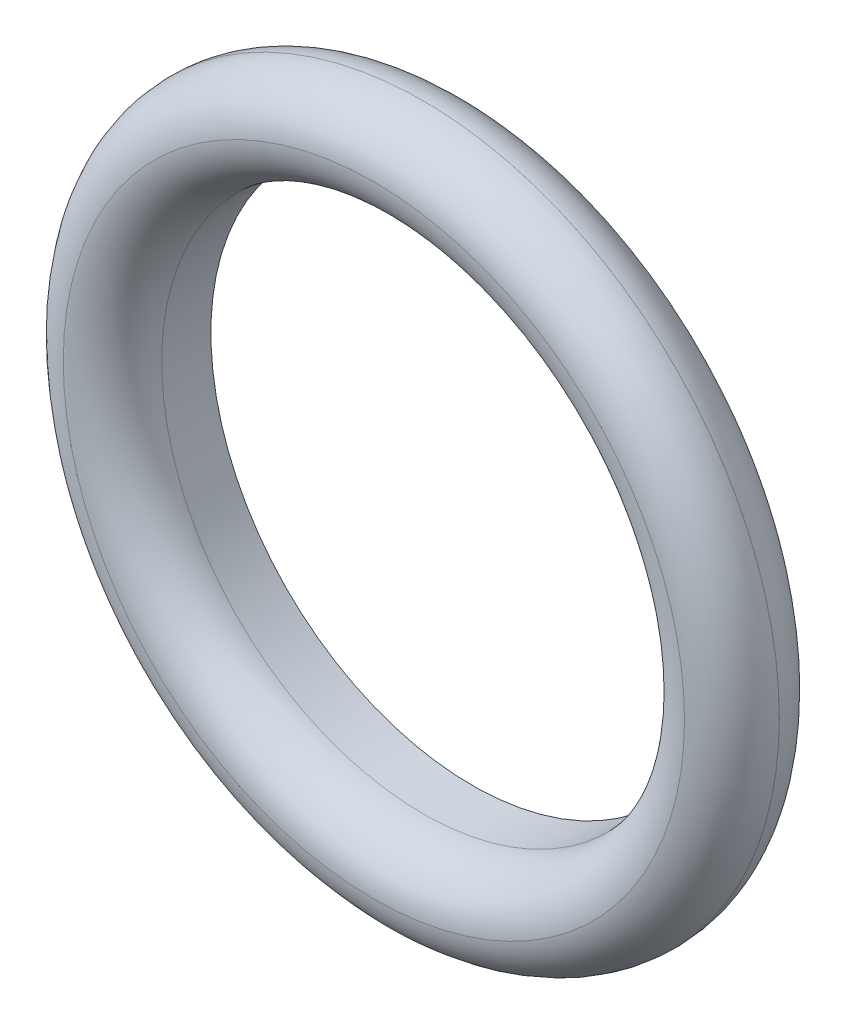
ISO-10303-21;
HEADER;
FILE_DESCRIPTION(('STEP AP214'),'2;1');
FILE_NAME('part.step','',(''),(''),'','','');
FILE_SCHEMA(('AUTOMOTIVE_DESIGN { 1 0 10303 214 1 1 1 1 }'));
ENDSEC;
DATA;
#1=APPLICATION_CONTEXT('core data for automotive mechanical design processes');
#2=APPLICATION_PROTOCOL_DEFINITION('international standard','automotive_design',2000,#1);
#3=PRODUCT_CONTEXT('',#1,'mechanical');
#4=PRODUCT('Part','Part','',(#3));
#5=PRODUCT_RELATED_PRODUCT_CATEGORY('part','',(#4));
#6=PRODUCT_DEFINITION_FORMATION('','',#4);
#7=PRODUCT_DEFINITION_CONTEXT('part definition',#1,'design');
#8=PRODUCT_DEFINITION('design','',#6,#7);
#9=PRODUCT_DEFINITION_SHAPE('','',#8);
#10=(LENGTH_UNIT() NAMED_UNIT(*) SI_UNIT(.MILLI.,.METRE.));
#11=(NAMED_UNIT(*) PLANE_ANGLE_UNIT() SI_UNIT($,.RADIAN.));
#12=(NAMED_UNIT(*) SI_UNIT($,.STERADIAN.) SOLID_ANGLE_UNIT());
#13=UNCERTAINTY_MEASURE_WITH_UNIT(LENGTH_MEASURE(1.E-05),#10,'distance_accuracy_value','');
#14=(GEOMETRIC_REPRESENTATION_CONTEXT(3) GLOBAL_UNCERTAINTY_ASSIGNED_CONTEXT((#13)) GLOBAL_UNIT_ASSIGNED_CONTEXT((#10,
#11,#12)) REPRESENTATION_CONTEXT('',''));
#15=CARTESIAN_POINT('',(0.,0.,0.));
#16=DIRECTION('',(0.,0.,1.));
#17=DIRECTION('',(1.,0.,0.));
#18=AXIS2_PLACEMENT_3D('',#15,#16,#17);
#19=CARTESIAN_POINT('',(0.,0.,0.));
#20=DIRECTION('',(0.,0.,1.));
#21=DIRECTION('',(1.,0.,0.));
#22=AXIS2_PLACEMENT_3D('',#19,#20,#21);
#23=PLANE('',#22);
#24=CARTESIAN_POINT('',(0.,0.,0.));
#25=DIRECTION('',(0.,0.,1.));
#26=DIRECTION('',(1.,0.,0.));
#27=AXIS2_PLACEMENT_3D('',#24,#25,#26);
#28=CIRCLE('',#27,62.401096357315);
#29=CARTESIAN_POINT('',(62.401096357315,0.,0.));
#30=VERTEX_POINT('',#29);
#31=EDGE_CURVE('E10',#30,#30,#28,.F.);
#32=ORIENTED_EDGE('',*,*,#31,.T.);
#33=EDGE_LOOP('',(#32));
#34=FACE_BOUND('',#33,.T.);
#35=CARTESIAN_POINT('',(0.,0.,0.));
#36=DIRECTION('',(0.,0.,1.));
#37=DIRECTION('',(1.,0.,0.));
#38=AXIS2_PLACEMENT_3D('',#35,#36,#37);
#39=CIRCLE('',#38,53.1170797746988);
#40=CARTESIAN_POINT('',(53.1170797746988,0.,0.));
#41=VERTEX_POINT('',#40);
#42=EDGE_CURVE('E58',#41,#41,#39,.T.);
#43=ORIENTED_EDGE('',*,*,#42,.T.);
#44=EDGE_LOOP('',(#43));
#45=FACE_BOUND('',#44,.T.);
#46=ADVANCED_FACE('F40',(#34,#45),#23,.F.);
#47=CARTESIAN_POINT('',(0.,0.,20.));
#48=DIRECTION('',(0.,0.,-1.));
#49=DIRECTION('',(-1.,0.,0.));
#50=AXIS2_PLACEMENT_3D('',#47,#48,#49);
#51=CYLINDRICAL_SURFACE('',#50,72.401096357315);
#52=CARTESIAN_POINT('',(0.,0.,10.));
#53=DIRECTION('',(0.,0.,1.));
#54=DIRECTION('',(1.,0.,0.));
#55=AXIS2_PLACEMENT_3D('',#52,#53,#54);
#56=CIRCLE('',#55,72.401096357315);
#57=CARTESIAN_POINT('',(72.401096357315,0.,10.));
#58=VERTEX_POINT('',#57);
#59=EDGE_CURVE('E42',#58,#58,#56,.T.);
#60=ORIENTED_EDGE('',*,*,#59,.T.);
#61=EDGE_LOOP('',(#60));
#62=FACE_BOUND('',#61,.T.);
#63=CARTESIAN_POINT('',(0.,0.,10.0256645461449));
#64=DIRECTION('',(0.,0.,1.));
#65=DIRECTION('',(1.,0.,0.));
#66=AXIS2_PLACEMENT_3D('',#63,#64,#65);
#67=CIRCLE('',#66,72.401096357315);
#68=CARTESIAN_POINT('',(72.401096357315,0.,10.0256645461449));
#69=VERTEX_POINT('',#68);
#70=EDGE_CURVE('E48',#69,#69,#67,.F.);
#71=ORIENTED_EDGE('',*,*,#70,.T.);
#72=EDGE_LOOP('',(#71));
#73=FACE_BOUND('',#72,.T.);
#74=ADVANCED_FACE('F67',(#62,#73),#51,.T.);
#75=CARTESIAN_POINT('',(0.,0.,20.));
#76=DIRECTION('',(0.,0.,-1.));
#77=DIRECTION('',(-1.,0.,0.));
#78=AXIS2_PLACEMENT_3D('',#75,#76,#77);
#79=CYLINDRICAL_SURFACE('',#78,53.1170797746988);
#80=CARTESIAN_POINT('',(0.,0.,10.));
#81=DIRECTION('',(0.,0.,1.));
#82=DIRECTION('',(1.,0.,0.));
#83=AXIS2_PLACEMENT_3D('',#80,#81,#82);
#84=CIRCLE('',#83,53.1170797746988);
#85=CARTESIAN_POINT('',(53.1170797746988,0.,10.));
#86=VERTEX_POINT('',#85);
#87=EDGE_CURVE('E60',#86,#86,#84,.T.);
#88=ORIENTED_EDGE('',*,*,#87,.T.);
#89=EDGE_LOOP('',(#88));
#90=FACE_BOUND('',#89,.T.);
#91=ORIENTED_EDGE('',*,*,#42,.F.);
#92=EDGE_LOOP('',(#91));
#93=FACE_BOUND('',#92,.T.);
#94=ADVANCED_FACE('F65',(#90,#93),#79,.F.);
#95=CARTESIAN_POINT('',(0.,0.,10.));
#96=DIRECTION('',(0.,0.,1.));
#97=DIRECTION('',(1.,0.,0.));
#98=AXIS2_PLACEMENT_3D('',#95,#96,#97);
#99=TOROIDAL_SURFACE('',#98,63.1170797746988,10.);
#100=CARTESIAN_POINT('',(0.,0.,20.));
#101=DIRECTION('',(0.,0.,1.));
#102=DIRECTION('',(1.,0.,0.));
#103=AXIS2_PLACEMENT_3D('',#100,#101,#102);
#104=CIRCLE('',#103,63.1170797746988);
#105=CARTESIAN_POINT('',(63.1170797746988,0.,20.));
#106=VERTEX_POINT('',#105);
#107=EDGE_CURVE('E55',#106,#106,#104,.F.);
#108=ORIENTED_EDGE('',*,*,#107,.F.);
#109=EDGE_LOOP('',(#108));
#110=FACE_BOUND('',#109,.T.);
#111=ORIENTED_EDGE('',*,*,#87,.F.);
#112=EDGE_LOOP('',(#111));
#113=FACE_BOUND('',#112,.T.);
#114=ADVANCED_FACE('F70',(#110,#113),#99,.T.);
#115=CARTESIAN_POINT('',(0.,0.,10.0256645461449));
#116=DIRECTION('',(0.,0.,1.));
#117=DIRECTION('',(1.,0.,0.));
#118=AXIS2_PLACEMENT_3D('',#115,#116,#117);
#119=TOROIDAL_SURFACE('',#118,62.401096357315,10.);
#120=ORIENTED_EDGE('',*,*,#70,.F.);
#121=EDGE_LOOP('',(#120));
#122=FACE_BOUND('',#121,.T.);
#123=ORIENTED_EDGE('',*,*,#107,.T.);
#124=EDGE_LOOP('',(#123));
#125=FACE_BOUND('',#124,.T.);
#126=ADVANCED_FACE('F74',(#122,#125),#119,.T.);
#127=CARTESIAN_POINT('',(0.,0.,10.));
#128=DIRECTION('',(0.,0.,1.));
#129=DIRECTION('',(1.,0.,0.));
#130=AXIS2_PLACEMENT_3D('',#127,#128,#129);
#131=TOROIDAL_SURFACE('',#130,62.401096357315,10.);
#132=ORIENTED_EDGE('',*,*,#31,.F.);
#133=EDGE_LOOP('',(#132));
#134=FACE_BOUND('',#133,.T.);
#135=ORIENTED_EDGE('',*,*,#59,.F.);
#136=EDGE_LOOP('',(#135));
#137=FACE_BOUND('',#136,.T.);
#138=ADVANCED_FACE('F39',(#134,#137),#131,.T.);
#139=CLOSED_SHELL('',(#46,#74,#94,#114,#126,#138));
#140=MANIFOLD_SOLID_BREP('B2',#139);
#141=ADVANCED_BREP_SHAPE_REPRESENTATION('',(#18,#140),#14);
#142=SHAPE_DEFINITION_REPRESENTATION(#9,#141);
ENDSEC;
END-ISO-10303-21;
